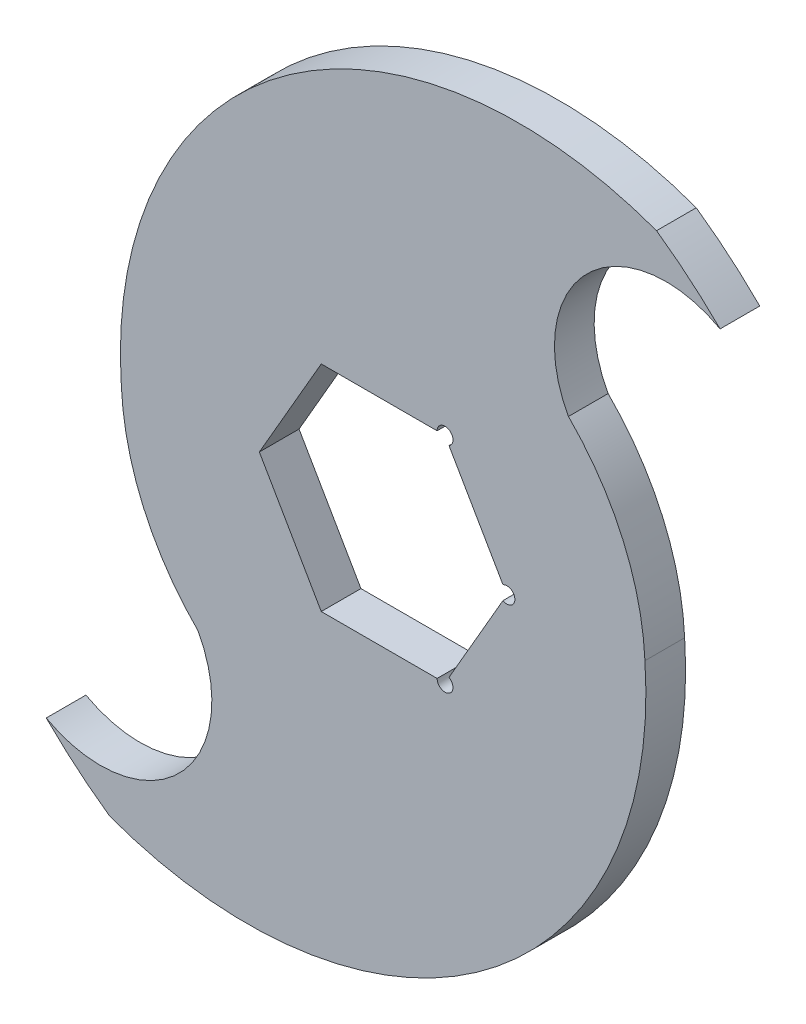
ISO-10303-21;
HEADER;
FILE_DESCRIPTION(('STEP AP214'),'2;1');
FILE_NAME('part.step','',(''),(''),'','','');
FILE_SCHEMA(('AUTOMOTIVE_DESIGN { 1 0 10303 214 1 1 1 1 }'));
ENDSEC;
DATA;
#1=APPLICATION_CONTEXT('core data for automotive mechanical design processes');
#2=APPLICATION_PROTOCOL_DEFINITION('international standard','automotive_design',2000,#1);
#3=PRODUCT_CONTEXT('',#1,'mechanical');
#4=PRODUCT('Part','Part','',(#3));
#5=PRODUCT_RELATED_PRODUCT_CATEGORY('part','',(#4));
#6=PRODUCT_DEFINITION_FORMATION('','',#4);
#7=PRODUCT_DEFINITION_CONTEXT('part definition',#1,'design');
#8=PRODUCT_DEFINITION('design','',#6,#7);
#9=PRODUCT_DEFINITION_SHAPE('','',#8);
#10=(LENGTH_UNIT() NAMED_UNIT(*) SI_UNIT(.MILLI.,.METRE.));
#11=(NAMED_UNIT(*) PLANE_ANGLE_UNIT() SI_UNIT($,.RADIAN.));
#12=(NAMED_UNIT(*) SI_UNIT($,.STERADIAN.) SOLID_ANGLE_UNIT());
#13=UNCERTAINTY_MEASURE_WITH_UNIT(LENGTH_MEASURE(1.E-05),#10,'distance_accuracy_value','');
#14=(GEOMETRIC_REPRESENTATION_CONTEXT(3) GLOBAL_UNCERTAINTY_ASSIGNED_CONTEXT((#13)) GLOBAL_UNIT_ASSIGNED_CONTEXT((#10,
#11,#12)) REPRESENTATION_CONTEXT('',''));
#15=CARTESIAN_POINT('',(0.,0.,0.));
#16=DIRECTION('',(0.,0.,1.));
#17=DIRECTION('',(1.,0.,0.));
#18=AXIS2_PLACEMENT_3D('',#15,#16,#17);
#19=CARTESIAN_POINT('',(781.536784045201,67.0737170226713,2.5));
#20=DIRECTION('',(0.,0.,1.));
#21=DIRECTION('',(1.,0.,0.));
#22=AXIS2_PLACEMENT_3D('',#19,#20,#21);
#23=PLANE('',#22);
#24=CARTESIAN_POINT('',(772.973593132538,66.073601988129,2.5));
#25=DIRECTION('',(0.,0.,1.));
#26=DIRECTION('',(1.,0.,0.));
#27=AXIS2_PLACEMENT_3D('',#24,#25,#26);
#28=CIRCLE('',#27,59.9999999999761);
#29=CARTESIAN_POINT('',(815.40000000371,108.500008859301,2.5));
#30=VERTEX_POINT('',#29);
#31=CARTESIAN_POINT('',(807.400029607275,115.214424851088,2.5));
#32=VERTEX_POINT('',#31);
#33=EDGE_CURVE('E224',#30,#32,#28,.T.);
#34=ORIENTED_EDGE('',*,*,#33,.T.);
#35=CARTESIAN_POINT('',(790.099974957864,68.0738320572136,2.5));
#36=DIRECTION('',(0.,0.,1.));
#37=DIRECTION('',(1.,0.,0.));
#38=AXIS2_PLACEMENT_3D('',#35,#36,#37);
#39=CIRCLE('',#38,50.2148123548267);
#40=CARTESIAN_POINT('',(740.008452339008,64.5571942375008,2.5));
#41=VERTEX_POINT('',#40);
#42=EDGE_CURVE('E227',#32,#41,#39,.T.);
#43=ORIENTED_EDGE('',*,*,#42,.T.);
#44=CARTESIAN_POINT('',(772.973593132538,66.073601988129,2.5));
#45=DIRECTION('',(0.,0.,1.));
#46=DIRECTION('',(1.,0.,0.));
#47=AXIS2_PLACEMENT_3D('',#44,#45,#46);
#48=CIRCLE('',#47,33.0000000000525);
#49=CARTESIAN_POINT('',(749.639069353385,42.7390782088959,2.5));
#50=VERTEX_POINT('',#49);
#51=EDGE_CURVE('E230',#41,#50,#48,.T.);
#52=ORIENTED_EDGE('',*,*,#51,.T.);
#53=CARTESIAN_POINT('',(737.363663293026,35.9226011772295,2.5));
#54=DIRECTION('',(0.,0.,-1.));
#55=DIRECTION('',(1.,0.,0.));
#56=AXIS2_PLACEMENT_3D('',#53,#54,#55);
#57=CIRCLE('',#56,14.0410096884066);
#58=CARTESIAN_POINT('',(730.547186261301,23.6471951169032,2.5));
#59=VERTEX_POINT('',#58);
#60=EDGE_CURVE('E232',#50,#59,#57,.T.);
#61=ORIENTED_EDGE('',*,*,#60,.T.);
#62=CARTESIAN_POINT('',(772.973593132538,66.073601988129,2.5));
#63=DIRECTION('',(0.,0.,1.));
#64=DIRECTION('',(1.,0.,0.));
#65=AXIS2_PLACEMENT_3D('',#62,#63,#64);
#66=CIRCLE('',#65,60.00000000005);
#67=CARTESIAN_POINT('',(738.547156657746,16.9327791251253,2.5));
#68=VERTEX_POINT('',#67);
#69=EDGE_CURVE('E234',#59,#68,#66,.T.);
#70=ORIENTED_EDGE('',*,*,#69,.T.);
#71=CARTESIAN_POINT('',(755.847211307125,64.0733719190284,2.5));
#72=DIRECTION('',(0.,0.,1.));
#73=DIRECTION('',(1.,0.,0.));
#74=AXIS2_PLACEMENT_3D('',#71,#72,#73);
#75=CIRCLE('',#74,50.2148123548384);
#76=CARTESIAN_POINT('',(805.938733925993,67.5900097387408,2.5));
#77=VERTEX_POINT('',#76);
#78=EDGE_CURVE('E236',#68,#77,#75,.T.);
#79=ORIENTED_EDGE('',*,*,#78,.T.);
#80=CARTESIAN_POINT('',(772.973593132538,66.073601988129,2.5));
#81=DIRECTION('',(0.,0.,1.));
#82=DIRECTION('',(1.,0.,0.));
#83=AXIS2_PLACEMENT_3D('',#80,#81,#82);
#84=CIRCLE('',#83,32.9999999999705);
#85=CARTESIAN_POINT('',(796.308116911673,89.4081257672646,2.5));
#86=VERTEX_POINT('',#85);
#87=EDGE_CURVE('E238',#77,#86,#84,.T.);
#88=ORIENTED_EDGE('',*,*,#87,.T.);
#89=CARTESIAN_POINT('',(808.583522972034,96.2246027989374,2.5));
#90=DIRECTION('',(0.,0.,-1.));
#91=DIRECTION('',(1.,0.,0.));
#92=AXIS2_PLACEMENT_3D('',#89,#90,#91);
#93=CIRCLE('',#92,14.0410096884161);
#94=EDGE_CURVE('E240',#86,#30,#93,.T.);
#95=ORIENTED_EDGE('',*,*,#94,.T.);
#96=EDGE_LOOP('',(#34,#43,#52,#61,#70,#79,#88,#95));
#97=FACE_BOUND('',#96,.T.);
#98=DIRECTION('',(-1.,0.,0.));
#99=VECTOR('',#98,1.);
#100=CARTESIAN_POINT('',(779.767821766624,79.573601988128,2.5));
#101=LINE('',#100,#99);
#102=CARTESIAN_POINT('',(779.767821766624,79.573601988128,2.5));
#103=VERTEX_POINT('',#102);
#104=CARTESIAN_POINT('',(765.179364498424,79.573601988128,2.5));
#105=VERTEX_POINT('',#104);
#106=EDGE_CURVE('E160',#103,#105,#101,.T.);
#107=ORIENTED_EDGE('',*,*,#106,.F.);
#108=CARTESIAN_POINT('',(780.767821766624,79.573601988128,2.5));
#109=DIRECTION('',(0.,0.,1.));
#110=DIRECTION('',(1.,0.,0.));
#111=AXIS2_PLACEMENT_3D('',#108,#109,#110);
#112=CIRCLE('',#111,0.999999999999945);
#113=CARTESIAN_POINT('',(781.267821766662,78.7075765843654,2.5));
#114=VERTEX_POINT('',#113);
#115=EDGE_CURVE('E152',#114,#103,#112,.T.);
#116=ORIENTED_EDGE('',*,*,#115,.F.);
#117=DIRECTION('',(-0.499999999999441,0.866025403784761,0.));
#118=VECTOR('',#117,1.);
#119=CARTESIAN_POINT('',(788.062050400724,66.9396273919125,2.5));
#120=LINE('',#119,#118);
#121=CARTESIAN_POINT('',(788.062050400724,66.9396273919125,2.5));
#122=VERTEX_POINT('',#121);
#123=EDGE_CURVE('E187',#122,#114,#120,.T.);
#124=ORIENTED_EDGE('',*,*,#123,.F.);
#125=CARTESIAN_POINT('',(788.562050400797,66.0736019881703,2.5));
#126=DIRECTION('',(0.,0.,1.));
#127=DIRECTION('',(1.,0.,0.));
#128=AXIS2_PLACEMENT_3D('',#125,#126,#127);
#129=CIRCLE('',#128,0.99999999999993);
#130=CARTESIAN_POINT('',(788.062050400724,65.207576584428,2.5));
#131=VERTEX_POINT('',#130);
#132=EDGE_CURVE('E185',#131,#122,#129,.T.);
#133=ORIENTED_EDGE('',*,*,#132,.F.);
#134=DIRECTION('',(0.499999999999529,0.86602540378471,0.));
#135=VECTOR('',#134,1.);
#136=CARTESIAN_POINT('',(781.267821766624,53.4396273919125,2.5));
#137=LINE('',#136,#135);
#138=CARTESIAN_POINT('',(781.267821766624,53.4396273919125,2.5));
#139=VERTEX_POINT('',#138);
#140=EDGE_CURVE('E183',#139,#131,#137,.T.);
#141=ORIENTED_EDGE('',*,*,#140,.F.);
#142=CARTESIAN_POINT('',(780.767821766624,52.573601988128,2.5));
#143=DIRECTION('',(0.,0.,1.));
#144=DIRECTION('',(1.,0.,0.));
#145=AXIS2_PLACEMENT_3D('',#142,#143,#144);
#146=CIRCLE('',#145,1.);
#147=CARTESIAN_POINT('',(779.767821766624,52.573601988128,2.5));
#148=VERTEX_POINT('',#147);
#149=EDGE_CURVE('E181',#148,#139,#146,.T.);
#150=ORIENTED_EDGE('',*,*,#149,.F.);
#151=DIRECTION('',(1.,0.,0.));
#152=VECTOR('',#151,1.);
#153=CARTESIAN_POINT('',(765.179364498424,52.573601988128,2.5));
#154=LINE('',#153,#152);
#155=CARTESIAN_POINT('',(765.179364498424,52.573601988128,2.5));
#156=VERTEX_POINT('',#155);
#157=EDGE_CURVE('E179',#156,#148,#154,.T.);
#158=ORIENTED_EDGE('',*,*,#157,.F.);
#159=DIRECTION('',(0.499999999997107,-0.866025403786109,0.));
#160=VECTOR('',#159,1.);
#161=CARTESIAN_POINT('',(757.385135864424,66.073601988128,2.5));
#162=LINE('',#161,#160);
#163=CARTESIAN_POINT('',(757.385135864424,66.073601988128,2.5));
#164=VERTEX_POINT('',#163);
#165=EDGE_CURVE('E175',#164,#156,#162,.T.);
#166=ORIENTED_EDGE('',*,*,#165,.F.);
#167=DIRECTION('',(-0.499999999997107,-0.866025403786109,0.));
#168=VECTOR('',#167,1.);
#169=CARTESIAN_POINT('',(765.179364498424,79.573601988128,2.5));
#170=LINE('',#169,#168);
#171=EDGE_CURVE('E173',#105,#164,#170,.T.);
#172=ORIENTED_EDGE('',*,*,#171,.F.);
#173=EDGE_LOOP('',(#107,#116,#124,#133,#141,#150,#158,#166,#172));
#174=FACE_BOUND('',#173,.T.);
#175=ADVANCED_FACE('F33',(#97,#174),#23,.T.);
#176=CARTESIAN_POINT('',(781.536784045201,67.0737170226713,-2.5));
#177=DIRECTION('',(0.,0.,1.));
#178=DIRECTION('',(1.,0.,0.));
#179=AXIS2_PLACEMENT_3D('',#176,#177,#178);
#180=PLANE('',#179);
#181=CARTESIAN_POINT('',(772.973593132538,66.073601988129,-2.5));
#182=DIRECTION('',(0.,0.,1.));
#183=DIRECTION('',(1.,0.,0.));
#184=AXIS2_PLACEMENT_3D('',#181,#182,#183);
#185=CIRCLE('',#184,59.9999999999761);
#186=CARTESIAN_POINT('',(815.40000000371,108.500008859301,-2.5));
#187=VERTEX_POINT('',#186);
#188=CARTESIAN_POINT('',(807.400029607275,115.214424851088,-2.5));
#189=VERTEX_POINT('',#188);
#190=EDGE_CURVE('E168',#187,#189,#185,.T.);
#191=ORIENTED_EDGE('',*,*,#190,.F.);
#192=CARTESIAN_POINT('',(808.583522972034,96.2246027989374,-2.5));
#193=DIRECTION('',(0.,0.,-1.));
#194=DIRECTION('',(1.,0.,0.));
#195=AXIS2_PLACEMENT_3D('',#192,#193,#194);
#196=CIRCLE('',#195,14.0410096884161);
#197=CARTESIAN_POINT('',(796.308116911673,89.4081257672646,-2.5));
#198=VERTEX_POINT('',#197);
#199=EDGE_CURVE('E228',#198,#187,#196,.T.);
#200=ORIENTED_EDGE('',*,*,#199,.F.);
#201=CARTESIAN_POINT('',(772.973593132538,66.073601988129,-2.5));
#202=DIRECTION('',(0.,0.,1.));
#203=DIRECTION('',(1.,0.,0.));
#204=AXIS2_PLACEMENT_3D('',#201,#202,#203);
#205=CIRCLE('',#204,32.9999999999705);
#206=CARTESIAN_POINT('',(805.938733925993,67.5900097387408,-2.5));
#207=VERTEX_POINT('',#206);
#208=EDGE_CURVE('E255',#207,#198,#205,.T.);
#209=ORIENTED_EDGE('',*,*,#208,.F.);
#210=CARTESIAN_POINT('',(755.847211307125,64.0733719190284,-2.5));
#211=DIRECTION('',(0.,0.,1.));
#212=DIRECTION('',(1.,0.,0.));
#213=AXIS2_PLACEMENT_3D('',#210,#211,#212);
#214=CIRCLE('',#213,50.2148123548384);
#215=CARTESIAN_POINT('',(738.547156657746,16.9327791251253,-2.5));
#216=VERTEX_POINT('',#215);
#217=EDGE_CURVE('E253',#216,#207,#214,.T.);
#218=ORIENTED_EDGE('',*,*,#217,.F.);
#219=CARTESIAN_POINT('',(772.973593132538,66.073601988129,-2.5));
#220=DIRECTION('',(0.,0.,1.));
#221=DIRECTION('',(1.,0.,0.));
#222=AXIS2_PLACEMENT_3D('',#219,#220,#221);
#223=CIRCLE('',#222,60.00000000005);
#224=CARTESIAN_POINT('',(730.547186261301,23.6471951169032,-2.5));
#225=VERTEX_POINT('',#224);
#226=EDGE_CURVE('E251',#225,#216,#223,.T.);
#227=ORIENTED_EDGE('',*,*,#226,.F.);
#228=CARTESIAN_POINT('',(737.363663293026,35.9226011772295,-2.5));
#229=DIRECTION('',(0.,0.,-1.));
#230=DIRECTION('',(1.,0.,0.));
#231=AXIS2_PLACEMENT_3D('',#228,#229,#230);
#232=CIRCLE('',#231,14.0410096884066);
#233=CARTESIAN_POINT('',(749.639069353385,42.7390782088959,-2.5));
#234=VERTEX_POINT('',#233);
#235=EDGE_CURVE('E249',#234,#225,#232,.T.);
#236=ORIENTED_EDGE('',*,*,#235,.F.);
#237=CARTESIAN_POINT('',(772.973593132538,66.073601988129,-2.5));
#238=DIRECTION('',(0.,0.,1.));
#239=DIRECTION('',(1.,0.,0.));
#240=AXIS2_PLACEMENT_3D('',#237,#238,#239);
#241=CIRCLE('',#240,33.0000000000525);
#242=CARTESIAN_POINT('',(740.008452339008,64.5571942375008,-2.5));
#243=VERTEX_POINT('',#242);
#244=EDGE_CURVE('E247',#243,#234,#241,.T.);
#245=ORIENTED_EDGE('',*,*,#244,.F.);
#246=CARTESIAN_POINT('',(790.099974957864,68.0738320572136,-2.5));
#247=DIRECTION('',(0.,0.,1.));
#248=DIRECTION('',(1.,0.,0.));
#249=AXIS2_PLACEMENT_3D('',#246,#247,#248);
#250=CIRCLE('',#249,50.2148123548267);
#251=EDGE_CURVE('E245',#189,#243,#250,.T.);
#252=ORIENTED_EDGE('',*,*,#251,.F.);
#253=EDGE_LOOP('',(#191,#200,#209,#218,#227,#236,#245,#252));
#254=FACE_BOUND('',#253,.T.);
#255=CARTESIAN_POINT('',(780.767821766624,79.573601988128,-2.5));
#256=DIRECTION('',(0.,0.,1.));
#257=DIRECTION('',(1.,0.,0.));
#258=AXIS2_PLACEMENT_3D('',#255,#256,#257);
#259=CIRCLE('',#258,0.999999999999945);
#260=CARTESIAN_POINT('',(781.267821766662,78.7075765843654,-2.5));
#261=VERTEX_POINT('',#260);
#262=CARTESIAN_POINT('',(779.767821766624,79.573601988128,-2.5));
#263=VERTEX_POINT('',#262);
#264=EDGE_CURVE('E56',#261,#263,#259,.T.);
#265=ORIENTED_EDGE('',*,*,#264,.T.);
#266=DIRECTION('',(-1.,0.,0.));
#267=VECTOR('',#266,1.);
#268=CARTESIAN_POINT('',(779.767821766624,79.573601988128,-2.5));
#269=LINE('',#268,#267);
#270=CARTESIAN_POINT('',(765.179364498424,79.573601988128,-2.5));
#271=VERTEX_POINT('',#270);
#272=EDGE_CURVE('E167',#263,#271,#269,.T.);
#273=ORIENTED_EDGE('',*,*,#272,.T.);
#274=DIRECTION('',(-0.499999999997107,-0.866025403786109,0.));
#275=VECTOR('',#274,1.);
#276=CARTESIAN_POINT('',(765.179364498424,79.573601988128,-2.5));
#277=LINE('',#276,#275);
#278=CARTESIAN_POINT('',(757.385135864424,66.073601988128,-2.5));
#279=VERTEX_POINT('',#278);
#280=EDGE_CURVE('E191',#271,#279,#277,.T.);
#281=ORIENTED_EDGE('',*,*,#280,.T.);
#282=DIRECTION('',(0.499999999997107,-0.866025403786109,0.));
#283=VECTOR('',#282,1.);
#284=CARTESIAN_POINT('',(757.385135864424,66.073601988128,-2.5));
#285=LINE('',#284,#283);
#286=CARTESIAN_POINT('',(765.179364498424,52.573601988128,-2.5));
#287=VERTEX_POINT('',#286);
#288=EDGE_CURVE('E194',#279,#287,#285,.T.);
#289=ORIENTED_EDGE('',*,*,#288,.T.);
#290=DIRECTION('',(1.,0.,0.));
#291=VECTOR('',#290,1.);
#292=CARTESIAN_POINT('',(765.179364498424,52.573601988128,-2.5));
#293=LINE('',#292,#291);
#294=CARTESIAN_POINT('',(779.767821766624,52.573601988128,-2.5));
#295=VERTEX_POINT('',#294);
#296=EDGE_CURVE('E197',#287,#295,#293,.T.);
#297=ORIENTED_EDGE('',*,*,#296,.T.);
#298=CARTESIAN_POINT('',(780.767821766624,52.573601988128,-2.5));
#299=DIRECTION('',(0.,0.,1.));
#300=DIRECTION('',(1.,0.,0.));
#301=AXIS2_PLACEMENT_3D('',#298,#299,#300);
#302=CIRCLE('',#301,1.);
#303=CARTESIAN_POINT('',(781.267821766624,53.4396273919125,-2.5));
#304=VERTEX_POINT('',#303);
#305=EDGE_CURVE('E200',#295,#304,#302,.T.);
#306=ORIENTED_EDGE('',*,*,#305,.T.);
#307=DIRECTION('',(0.499999999999529,0.86602540378471,0.));
#308=VECTOR('',#307,1.);
#309=CARTESIAN_POINT('',(781.267821766624,53.4396273919125,-2.5));
#310=LINE('',#309,#308);
#311=CARTESIAN_POINT('',(788.062050400724,65.207576584428,-2.5));
#312=VERTEX_POINT('',#311);
#313=EDGE_CURVE('E203',#304,#312,#310,.T.);
#314=ORIENTED_EDGE('',*,*,#313,.T.);
#315=CARTESIAN_POINT('',(788.562050400797,66.0736019881703,-2.5));
#316=DIRECTION('',(0.,0.,1.));
#317=DIRECTION('',(1.,0.,0.));
#318=AXIS2_PLACEMENT_3D('',#315,#316,#317);
#319=CIRCLE('',#318,0.99999999999993);
#320=CARTESIAN_POINT('',(788.062050400724,66.9396273919125,-2.5));
#321=VERTEX_POINT('',#320);
#322=EDGE_CURVE('E206',#312,#321,#319,.T.);
#323=ORIENTED_EDGE('',*,*,#322,.T.);
#324=DIRECTION('',(-0.499999999999441,0.866025403784761,0.));
#325=VECTOR('',#324,1.);
#326=CARTESIAN_POINT('',(788.062050400724,66.9396273919125,-2.5));
#327=LINE('',#326,#325);
#328=EDGE_CURVE('E161',#321,#261,#327,.T.);
#329=ORIENTED_EDGE('',*,*,#328,.T.);
#330=EDGE_LOOP('',(#265,#273,#281,#289,#297,#306,#314,#323,#329));
#331=FACE_BOUND('',#330,.T.);
#332=ADVANCED_FACE('F285',(#254,#331),#180,.F.);
#333=CARTESIAN_POINT('',(772.973593132538,66.073601988129,2.5));
#334=DIRECTION('',(0.,0.,-1.));
#335=DIRECTION('',(-1.,0.,0.));
#336=AXIS2_PLACEMENT_3D('',#333,#334,#335);
#337=CYLINDRICAL_SURFACE('',#336,59.9999999999761);
#338=ORIENTED_EDGE('',*,*,#190,.T.);
#339=DIRECTION('',(0.,0.,-1.));
#340=VECTOR('',#339,1.);
#341=CARTESIAN_POINT('',(807.400029607275,115.214424851088,2.5));
#342=LINE('',#341,#340);
#343=EDGE_CURVE('E11',#32,#189,#342,.T.);
#344=ORIENTED_EDGE('',*,*,#343,.F.);
#345=ORIENTED_EDGE('',*,*,#33,.F.);
#346=DIRECTION('',(0.,0.,-1.));
#347=VECTOR('',#346,1.);
#348=CARTESIAN_POINT('',(815.40000000371,108.500008859301,2.5));
#349=LINE('',#348,#347);
#350=EDGE_CURVE('E242',#30,#187,#349,.T.);
#351=ORIENTED_EDGE('',*,*,#350,.T.);
#352=EDGE_LOOP('',(#338,#344,#345,#351));
#353=FACE_BOUND('',#352,.T.);
#354=ADVANCED_FACE('F35',(#353),#337,.T.);
#355=CARTESIAN_POINT('',(790.099974957864,68.0738320572136,2.5));
#356=DIRECTION('',(0.,0.,-1.));
#357=DIRECTION('',(-1.,0.,0.));
#358=AXIS2_PLACEMENT_3D('',#355,#356,#357);
#359=CYLINDRICAL_SURFACE('',#358,50.2148123548267);
#360=ORIENTED_EDGE('',*,*,#251,.T.);
#361=DIRECTION('',(0.,0.,-1.));
#362=VECTOR('',#361,1.);
#363=CARTESIAN_POINT('',(740.008452339008,64.5571942375008,2.5));
#364=LINE('',#363,#362);
#365=EDGE_CURVE('E41',#41,#243,#364,.T.);
#366=ORIENTED_EDGE('',*,*,#365,.F.);
#367=ORIENTED_EDGE('',*,*,#42,.F.);
#368=ORIENTED_EDGE('',*,*,#343,.T.);
#369=EDGE_LOOP('',(#360,#366,#367,#368));
#370=FACE_BOUND('',#369,.T.);
#371=ADVANCED_FACE('F302',(#370),#359,.T.);
#372=CARTESIAN_POINT('',(772.973593132538,66.073601988129,2.5));
#373=DIRECTION('',(0.,0.,-1.));
#374=DIRECTION('',(-1.,0.,0.));
#375=AXIS2_PLACEMENT_3D('',#372,#373,#374);
#376=CYLINDRICAL_SURFACE('',#375,33.0000000000525);
#377=ORIENTED_EDGE('',*,*,#244,.T.);
#378=DIRECTION('',(0.,0.,-1.));
#379=VECTOR('',#378,1.);
#380=CARTESIAN_POINT('',(749.639069353385,42.7390782088959,2.5));
#381=LINE('',#380,#379);
#382=EDGE_CURVE('E272',#50,#234,#381,.T.);
#383=ORIENTED_EDGE('',*,*,#382,.F.);
#384=ORIENTED_EDGE('',*,*,#51,.F.);
#385=ORIENTED_EDGE('',*,*,#365,.T.);
#386=EDGE_LOOP('',(#377,#383,#384,#385));
#387=FACE_BOUND('',#386,.T.);
#388=ADVANCED_FACE('F279',(#387),#376,.T.);
#389=CARTESIAN_POINT('',(737.363663293026,35.9226011772295,2.5));
#390=DIRECTION('',(0.,0.,-1.));
#391=DIRECTION('',(-1.,0.,0.));
#392=AXIS2_PLACEMENT_3D('',#389,#390,#391);
#393=CYLINDRICAL_SURFACE('',#392,14.0410096884066);
#394=ORIENTED_EDGE('',*,*,#235,.T.);
#395=DIRECTION('',(0.,0.,-1.));
#396=VECTOR('',#395,1.);
#397=CARTESIAN_POINT('',(730.547186261301,23.6471951169032,2.5));
#398=LINE('',#397,#396);
#399=EDGE_CURVE('E269',#59,#225,#398,.T.);
#400=ORIENTED_EDGE('',*,*,#399,.F.);
#401=ORIENTED_EDGE('',*,*,#60,.F.);
#402=ORIENTED_EDGE('',*,*,#382,.T.);
#403=EDGE_LOOP('',(#394,#400,#401,#402));
#404=FACE_BOUND('',#403,.T.);
#405=ADVANCED_FACE('F291',(#404),#393,.F.);
#406=CARTESIAN_POINT('',(772.973593132538,66.073601988129,2.5));
#407=DIRECTION('',(0.,0.,-1.));
#408=DIRECTION('',(-1.,0.,0.));
#409=AXIS2_PLACEMENT_3D('',#406,#407,#408);
#410=CYLINDRICAL_SURFACE('',#409,60.00000000005);
#411=ORIENTED_EDGE('',*,*,#226,.T.);
#412=DIRECTION('',(0.,0.,-1.));
#413=VECTOR('',#412,1.);
#414=CARTESIAN_POINT('',(738.547156657746,16.9327791251253,2.5));
#415=LINE('',#414,#413);
#416=EDGE_CURVE('E266',#68,#216,#415,.T.);
#417=ORIENTED_EDGE('',*,*,#416,.F.);
#418=ORIENTED_EDGE('',*,*,#69,.F.);
#419=ORIENTED_EDGE('',*,*,#399,.T.);
#420=EDGE_LOOP('',(#411,#417,#418,#419));
#421=FACE_BOUND('',#420,.T.);
#422=ADVANCED_FACE('F295',(#421),#410,.T.);
#423=CARTESIAN_POINT('',(755.847211307125,64.0733719190284,2.5));
#424=DIRECTION('',(0.,0.,-1.));
#425=DIRECTION('',(-1.,0.,0.));
#426=AXIS2_PLACEMENT_3D('',#423,#424,#425);
#427=CYLINDRICAL_SURFACE('',#426,50.2148123548384);
#428=ORIENTED_EDGE('',*,*,#217,.T.);
#429=DIRECTION('',(0.,0.,-1.));
#430=VECTOR('',#429,1.);
#431=CARTESIAN_POINT('',(805.938733925993,67.5900097387408,2.5));
#432=LINE('',#431,#430);
#433=EDGE_CURVE('E263',#77,#207,#432,.T.);
#434=ORIENTED_EDGE('',*,*,#433,.F.);
#435=ORIENTED_EDGE('',*,*,#78,.F.);
#436=ORIENTED_EDGE('',*,*,#416,.T.);
#437=EDGE_LOOP('',(#428,#434,#435,#436));
#438=FACE_BOUND('',#437,.T.);
#439=ADVANCED_FACE('F315',(#438),#427,.T.);
#440=CARTESIAN_POINT('',(772.973593132538,66.073601988129,2.5));
#441=DIRECTION('',(0.,0.,-1.));
#442=DIRECTION('',(-1.,0.,0.));
#443=AXIS2_PLACEMENT_3D('',#440,#441,#442);
#444=CYLINDRICAL_SURFACE('',#443,32.9999999999705);
#445=ORIENTED_EDGE('',*,*,#208,.T.);
#446=DIRECTION('',(0.,0.,-1.));
#447=VECTOR('',#446,1.);
#448=CARTESIAN_POINT('',(796.308116911673,89.4081257672646,2.5));
#449=LINE('',#448,#447);
#450=EDGE_CURVE('E260',#86,#198,#449,.T.);
#451=ORIENTED_EDGE('',*,*,#450,.F.);
#452=ORIENTED_EDGE('',*,*,#87,.F.);
#453=ORIENTED_EDGE('',*,*,#433,.T.);
#454=EDGE_LOOP('',(#445,#451,#452,#453));
#455=FACE_BOUND('',#454,.T.);
#456=ADVANCED_FACE('F313',(#455),#444,.T.);
#457=CARTESIAN_POINT('',(808.583522972034,96.2246027989374,2.5));
#458=DIRECTION('',(0.,0.,-1.));
#459=DIRECTION('',(-1.,0.,0.));
#460=AXIS2_PLACEMENT_3D('',#457,#458,#459);
#461=CYLINDRICAL_SURFACE('',#460,14.0410096884161);
#462=ORIENTED_EDGE('',*,*,#199,.T.);
#463=ORIENTED_EDGE('',*,*,#350,.F.);
#464=ORIENTED_EDGE('',*,*,#94,.F.);
#465=ORIENTED_EDGE('',*,*,#450,.T.);
#466=EDGE_LOOP('',(#462,#463,#464,#465));
#467=FACE_BOUND('',#466,.T.);
#468=ADVANCED_FACE('F308',(#467),#461,.F.);
#469=CARTESIAN_POINT('',(780.767821766624,79.573601988128,2.5));
#470=DIRECTION('',(0.,0.,-1.));
#471=DIRECTION('',(-1.,0.,0.));
#472=AXIS2_PLACEMENT_3D('',#469,#470,#471);
#473=CYLINDRICAL_SURFACE('',#472,0.999999999999945);
#474=ORIENTED_EDGE('',*,*,#264,.F.);
#475=DIRECTION('',(0.,0.,-1.));
#476=VECTOR('',#475,1.);
#477=CARTESIAN_POINT('',(781.267821766662,78.7075765843654,2.5));
#478=LINE('',#477,#476);
#479=EDGE_CURVE('E156',#114,#261,#478,.T.);
#480=ORIENTED_EDGE('',*,*,#479,.F.);
#481=ORIENTED_EDGE('',*,*,#115,.T.);
#482=DIRECTION('',(0.,0.,-1.));
#483=VECTOR('',#482,1.);
#484=CARTESIAN_POINT('',(779.767821766624,79.573601988128,2.5));
#485=LINE('',#484,#483);
#486=EDGE_CURVE('E155',#103,#263,#485,.T.);
#487=ORIENTED_EDGE('',*,*,#486,.T.);
#488=EDGE_LOOP('',(#474,#480,#481,#487));
#489=FACE_BOUND('',#488,.T.);
#490=ADVANCED_FACE('F154',(#489),#473,.F.);
#491=CARTESIAN_POINT('',(779.767821766624,79.573601988128,2.5));
#492=DIRECTION('',(0.,-1.,0.));
#493=DIRECTION('',(0.,0.,-1.));
#494=AXIS2_PLACEMENT_3D('',#491,#492,#493);
#495=PLANE('',#494);
#496=ORIENTED_EDGE('',*,*,#272,.F.);
#497=ORIENTED_EDGE('',*,*,#486,.F.);
#498=ORIENTED_EDGE('',*,*,#106,.T.);
#499=DIRECTION('',(0.,0.,-1.));
#500=VECTOR('',#499,1.);
#501=CARTESIAN_POINT('',(765.179364498424,79.573601988128,2.5));
#502=LINE('',#501,#500);
#503=EDGE_CURVE('E169',#105,#271,#502,.T.);
#504=ORIENTED_EDGE('',*,*,#503,.T.);
#505=EDGE_LOOP('',(#496,#497,#498,#504));
#506=FACE_BOUND('',#505,.T.);
#507=ADVANCED_FACE('F164',(#506),#495,.T.);
#508=CARTESIAN_POINT('',(765.179364498424,79.573601988128,2.5));
#509=DIRECTION('',(0.866025403786109,-0.499999999997107,0.));
#510=DIRECTION('',(0.499999999997107,0.866025403786109,0.));
#511=AXIS2_PLACEMENT_3D('',#508,#509,#510);
#512=PLANE('',#511);
#513=ORIENTED_EDGE('',*,*,#280,.F.);
#514=ORIENTED_EDGE('',*,*,#503,.F.);
#515=ORIENTED_EDGE('',*,*,#171,.T.);
#516=DIRECTION('',(0.,0.,-1.));
#517=VECTOR('',#516,1.);
#518=CARTESIAN_POINT('',(757.385135864424,66.073601988128,2.5));
#519=LINE('',#518,#517);
#520=EDGE_CURVE('E221',#164,#279,#519,.T.);
#521=ORIENTED_EDGE('',*,*,#520,.T.);
#522=EDGE_LOOP('',(#513,#514,#515,#521));
#523=FACE_BOUND('',#522,.T.);
#524=ADVANCED_FACE('F340',(#523),#512,.T.);
#525=CARTESIAN_POINT('',(757.385135864424,66.073601988128,2.5));
#526=DIRECTION('',(0.866025403786109,0.499999999997107,0.));
#527=DIRECTION('',(-0.499999999997107,0.866025403786109,0.));
#528=AXIS2_PLACEMENT_3D('',#525,#526,#527);
#529=PLANE('',#528);
#530=ORIENTED_EDGE('',*,*,#288,.F.);
#531=ORIENTED_EDGE('',*,*,#520,.F.);
#532=ORIENTED_EDGE('',*,*,#165,.T.);
#533=DIRECTION('',(0.,0.,-1.));
#534=VECTOR('',#533,1.);
#535=CARTESIAN_POINT('',(765.179364498424,52.573601988128,2.5));
#536=LINE('',#535,#534);
#537=EDGE_CURVE('E219',#156,#287,#536,.T.);
#538=ORIENTED_EDGE('',*,*,#537,.T.);
#539=EDGE_LOOP('',(#530,#531,#532,#538));
#540=FACE_BOUND('',#539,.T.);
#541=ADVANCED_FACE('F344',(#540),#529,.T.);
#542=CARTESIAN_POINT('',(765.179364498424,52.573601988128,2.5));
#543=DIRECTION('',(0.,1.,0.));
#544=DIRECTION('',(0.,0.,1.));
#545=AXIS2_PLACEMENT_3D('',#542,#543,#544);
#546=PLANE('',#545);
#547=ORIENTED_EDGE('',*,*,#296,.F.);
#548=ORIENTED_EDGE('',*,*,#537,.F.);
#549=ORIENTED_EDGE('',*,*,#157,.T.);
#550=DIRECTION('',(0.,0.,-1.));
#551=VECTOR('',#550,1.);
#552=CARTESIAN_POINT('',(779.767821766624,52.573601988128,2.5));
#553=LINE('',#552,#551);
#554=EDGE_CURVE('E217',#148,#295,#553,.T.);
#555=ORIENTED_EDGE('',*,*,#554,.T.);
#556=EDGE_LOOP('',(#547,#548,#549,#555));
#557=FACE_BOUND('',#556,.T.);
#558=ADVANCED_FACE('F350',(#557),#546,.T.);
#559=CARTESIAN_POINT('',(780.767821766624,52.573601988128,2.5));
#560=DIRECTION('',(0.,0.,-1.));
#561=DIRECTION('',(-1.,0.,0.));
#562=AXIS2_PLACEMENT_3D('',#559,#560,#561);
#563=CYLINDRICAL_SURFACE('',#562,1.);
#564=ORIENTED_EDGE('',*,*,#305,.F.);
#565=ORIENTED_EDGE('',*,*,#554,.F.);
#566=ORIENTED_EDGE('',*,*,#149,.T.);
#567=DIRECTION('',(0.,0.,-1.));
#568=VECTOR('',#567,1.);
#569=CARTESIAN_POINT('',(781.267821766624,53.4396273919125,2.5));
#570=LINE('',#569,#568);
#571=EDGE_CURVE('E215',#139,#304,#570,.T.);
#572=ORIENTED_EDGE('',*,*,#571,.T.);
#573=EDGE_LOOP('',(#564,#565,#566,#572));
#574=FACE_BOUND('',#573,.T.);
#575=ADVANCED_FACE('F354',(#574),#563,.F.);
#576=CARTESIAN_POINT('',(781.267821766624,53.4396273919125,2.5));
#577=DIRECTION('',(-0.86602540378471,0.499999999999529,0.));
#578=DIRECTION('',(-0.499999999999529,-0.86602540378471,0.));
#579=AXIS2_PLACEMENT_3D('',#576,#577,#578);
#580=PLANE('',#579);
#581=ORIENTED_EDGE('',*,*,#313,.F.);
#582=ORIENTED_EDGE('',*,*,#571,.F.);
#583=ORIENTED_EDGE('',*,*,#140,.T.);
#584=DIRECTION('',(0.,0.,-1.));
#585=VECTOR('',#584,1.);
#586=CARTESIAN_POINT('',(788.062050400724,65.207576584428,2.5));
#587=LINE('',#586,#585);
#588=EDGE_CURVE('E213',#131,#312,#587,.T.);
#589=ORIENTED_EDGE('',*,*,#588,.T.);
#590=EDGE_LOOP('',(#581,#582,#583,#589));
#591=FACE_BOUND('',#590,.T.);
#592=ADVANCED_FACE('F358',(#591),#580,.T.);
#593=CARTESIAN_POINT('',(788.562050400797,66.0736019881703,2.5));
#594=DIRECTION('',(0.,0.,-1.));
#595=DIRECTION('',(-1.,0.,0.));
#596=AXIS2_PLACEMENT_3D('',#593,#594,#595);
#597=CYLINDRICAL_SURFACE('',#596,0.99999999999993);
#598=ORIENTED_EDGE('',*,*,#322,.F.);
#599=ORIENTED_EDGE('',*,*,#588,.F.);
#600=ORIENTED_EDGE('',*,*,#132,.T.);
#601=DIRECTION('',(0.,0.,-1.));
#602=VECTOR('',#601,1.);
#603=CARTESIAN_POINT('',(788.062050400724,66.9396273919125,2.5));
#604=LINE('',#603,#602);
#605=EDGE_CURVE('E48',#122,#321,#604,.T.);
#606=ORIENTED_EDGE('',*,*,#605,.T.);
#607=EDGE_LOOP('',(#598,#599,#600,#606));
#608=FACE_BOUND('',#607,.T.);
#609=ADVANCED_FACE('F362',(#608),#597,.F.);
#610=CARTESIAN_POINT('',(788.062050400724,66.9396273919125,2.5));
#611=DIRECTION('',(-0.866025403784761,-0.499999999999441,0.));
#612=DIRECTION('',(0.499999999999441,-0.866025403784761,0.));
#613=AXIS2_PLACEMENT_3D('',#610,#611,#612);
#614=PLANE('',#613);
#615=ORIENTED_EDGE('',*,*,#328,.F.);
#616=ORIENTED_EDGE('',*,*,#605,.F.);
#617=ORIENTED_EDGE('',*,*,#123,.T.);
#618=ORIENTED_EDGE('',*,*,#479,.T.);
#619=EDGE_LOOP('',(#615,#616,#617,#618));
#620=FACE_BOUND('',#619,.T.);
#621=ADVANCED_FACE('F366',(#620),#614,.T.);
#622=CLOSED_SHELL('',(#175,#332,#354,#371,#388,#405,#422,#439,#456,#468,#490,#507,#524,#541,
#558,#575,#592,#609,#621));
#623=MANIFOLD_SOLID_BREP('B2',#622);
#624=ADVANCED_BREP_SHAPE_REPRESENTATION('',(#18,#623),#14);
#625=SHAPE_DEFINITION_REPRESENTATION(#9,#624);
ENDSEC;
END-ISO-10303-21;
